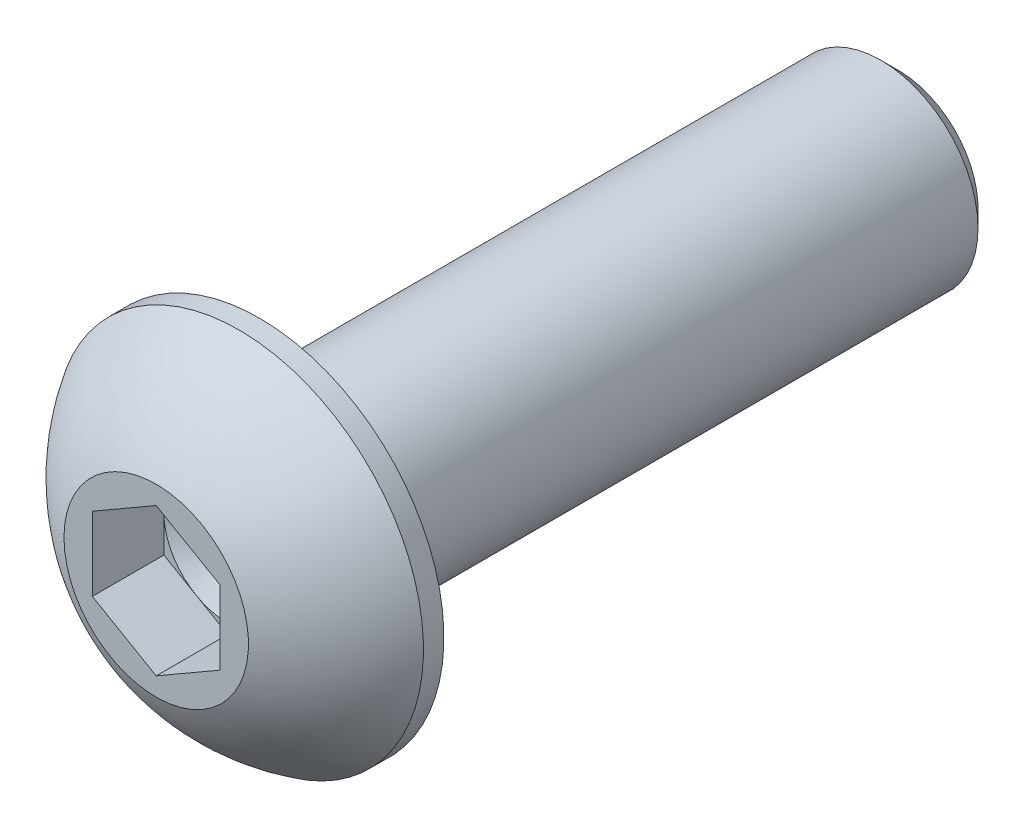
ISO-10303-21;
HEADER;
FILE_DESCRIPTION(('STEP AP214'),'2;1');
FILE_NAME('part.step','',(''),(''),'','','');
FILE_SCHEMA(('AUTOMOTIVE_DESIGN { 1 0 10303 214 1 1 1 1 }'));
ENDSEC;
DATA;
#1=APPLICATION_CONTEXT('core data for automotive mechanical design processes');
#2=APPLICATION_PROTOCOL_DEFINITION('international standard','automotive_design',2000,#1);
#3=PRODUCT_CONTEXT('',#1,'mechanical');
#4=PRODUCT('Part','Part','',(#3));
#5=PRODUCT_RELATED_PRODUCT_CATEGORY('part','',(#4));
#6=PRODUCT_DEFINITION_FORMATION('','',#4);
#7=PRODUCT_DEFINITION_CONTEXT('part definition',#1,'design');
#8=PRODUCT_DEFINITION('design','',#6,#7);
#9=PRODUCT_DEFINITION_SHAPE('','',#8);
#10=(LENGTH_UNIT() NAMED_UNIT(*) SI_UNIT(.MILLI.,.METRE.));
#11=(NAMED_UNIT(*) PLANE_ANGLE_UNIT() SI_UNIT($,.RADIAN.));
#12=(NAMED_UNIT(*) SI_UNIT($,.STERADIAN.) SOLID_ANGLE_UNIT());
#13=UNCERTAINTY_MEASURE_WITH_UNIT(LENGTH_MEASURE(1.E-05),#10,'distance_accuracy_value','');
#14=(GEOMETRIC_REPRESENTATION_CONTEXT(3) GLOBAL_UNCERTAINTY_ASSIGNED_CONTEXT((#13)) GLOBAL_UNIT_ASSIGNED_CONTEXT((#10,
#11,#12)) REPRESENTATION_CONTEXT('',''));
#15=CARTESIAN_POINT('',(0.,0.,0.));
#16=DIRECTION('',(0.,0.,1.));
#17=DIRECTION('',(1.,0.,0.));
#18=AXIS2_PLACEMENT_3D('',#15,#16,#17);
#19=CARTESIAN_POINT('',(0.,0.,-1.778));
#20=DIRECTION('',(0.,0.,1.));
#21=DIRECTION('',(1.,0.,0.));
#22=AXIS2_PLACEMENT_3D('',#19,#20,#21);
#23=PLANE('',#22);
#24=CARTESIAN_POINT('',(0.,0.,-1.778));
#25=DIRECTION('',(0.,0.,1.));
#26=DIRECTION('',(1.,0.,0.));
#27=AXIS2_PLACEMENT_3D('',#24,#25,#26);
#28=CIRCLE('',#27,1.5875);
#29=CARTESIAN_POINT('',(1.5875,0.,-1.778));
#30=VERTEX_POINT('',#29);
#31=CARTESIAN_POINT('',(0.79375,1.3748153285078,-1.778));
#32=VERTEX_POINT('',#31);
#33=EDGE_CURVE('E96',#30,#32,#28,.T.);
#34=ORIENTED_EDGE('',*,*,#33,.F.);
#35=DIRECTION('',(0.,-1.,0.));
#36=VECTOR('',#35,1.);
#37=CARTESIAN_POINT('',(1.5875,0.,-1.778));
#38=LINE('',#37,#36);
#39=CARTESIAN_POINT('',(1.5875,0.916543552338531,-1.778));
#40=VERTEX_POINT('',#39);
#41=EDGE_CURVE('E120',#40,#30,#38,.T.);
#42=ORIENTED_EDGE('',*,*,#41,.F.);
#43=DIRECTION('',(0.866025403784438,-0.5,0.));
#44=VECTOR('',#43,1.);
#45=CARTESIAN_POINT('',(0.79375,1.3748153285078,-1.778));
#46=LINE('',#45,#44);
#47=EDGE_CURVE('E118',#32,#40,#46,.T.);
#48=ORIENTED_EDGE('',*,*,#47,.F.);
#49=EDGE_LOOP('',(#34,#42,#48));
#50=FACE_BOUND('',#49,.T.);
#51=ADVANCED_FACE('F17',(#50),#23,.T.);
#52=CARTESIAN_POINT('',(-0.79375,1.37481532850779,-1.778));
#53=VERTEX_POINT('',#52);
#54=EDGE_CURVE('E98',#32,#53,#28,.T.);
#55=ORIENTED_EDGE('',*,*,#54,.F.);
#56=CARTESIAN_POINT('',(0.,1.83308710467706,-1.778));
#57=VERTEX_POINT('',#56);
#58=EDGE_CURVE('E113',#57,#32,#46,.T.);
#59=ORIENTED_EDGE('',*,*,#58,.F.);
#60=DIRECTION('',(0.866025403784437,0.5,0.));
#61=VECTOR('',#60,1.);
#62=CARTESIAN_POINT('',(-0.79375,1.37481532850779,-1.778));
#63=LINE('',#62,#61);
#64=EDGE_CURVE('E114',#53,#57,#63,.T.);
#65=ORIENTED_EDGE('',*,*,#64,.F.);
#66=EDGE_LOOP('',(#55,#59,#65));
#67=FACE_BOUND('',#66,.T.);
#68=ADVANCED_FACE('F111',(#67),#23,.T.);
#69=CARTESIAN_POINT('',(-1.5875,0.,-1.778));
#70=VERTEX_POINT('',#69);
#71=EDGE_CURVE('E117',#53,#70,#28,.T.);
#72=ORIENTED_EDGE('',*,*,#71,.F.);
#73=CARTESIAN_POINT('',(-1.5875,0.916543552338527,-1.778));
#74=VERTEX_POINT('',#73);
#75=EDGE_CURVE('E135',#74,#53,#63,.T.);
#76=ORIENTED_EDGE('',*,*,#75,.F.);
#77=DIRECTION('',(0.,1.,0.));
#78=VECTOR('',#77,1.);
#79=CARTESIAN_POINT('',(-1.5875,0.,-1.778));
#80=LINE('',#79,#78);
#81=EDGE_CURVE('E139',#70,#74,#80,.T.);
#82=ORIENTED_EDGE('',*,*,#81,.F.);
#83=EDGE_LOOP('',(#72,#76,#82));
#84=FACE_BOUND('',#83,.T.);
#85=ADVANCED_FACE('F227',(#84),#23,.T.);
#86=CARTESIAN_POINT('',(-0.79375,-1.3748153285078,-1.778));
#87=VERTEX_POINT('',#86);
#88=EDGE_CURVE('E252',#70,#87,#28,.T.);
#89=ORIENTED_EDGE('',*,*,#88,.F.);
#90=CARTESIAN_POINT('',(-1.5875,-0.916543552338531,-1.778));
#91=VERTEX_POINT('',#90);
#92=EDGE_CURVE('E140',#91,#70,#80,.T.);
#93=ORIENTED_EDGE('',*,*,#92,.F.);
#94=DIRECTION('',(-0.866025403784438,0.5,0.));
#95=VECTOR('',#94,1.);
#96=CARTESIAN_POINT('',(-0.79375,-1.3748153285078,-1.778));
#97=LINE('',#96,#95);
#98=EDGE_CURVE('E144',#87,#91,#97,.T.);
#99=ORIENTED_EDGE('',*,*,#98,.F.);
#100=EDGE_LOOP('',(#89,#93,#99));
#101=FACE_BOUND('',#100,.T.);
#102=ADVANCED_FACE('F239',(#101),#23,.T.);
#103=CARTESIAN_POINT('',(0.79375,-1.37481532850779,-1.778));
#104=VERTEX_POINT('',#103);
#105=EDGE_CURVE('E33',#87,#104,#28,.T.);
#106=ORIENTED_EDGE('',*,*,#105,.F.);
#107=CARTESIAN_POINT('',(0.,-1.83308710467706,-1.778));
#108=VERTEX_POINT('',#107);
#109=EDGE_CURVE('E145',#108,#87,#97,.T.);
#110=ORIENTED_EDGE('',*,*,#109,.F.);
#111=DIRECTION('',(-0.866025403784437,-0.5,0.));
#112=VECTOR('',#111,1.);
#113=CARTESIAN_POINT('',(0.79375,-1.37481532850779,-1.778));
#114=LINE('',#113,#112);
#115=EDGE_CURVE('E149',#104,#108,#114,.T.);
#116=ORIENTED_EDGE('',*,*,#115,.F.);
#117=EDGE_LOOP('',(#106,#110,#116));
#118=FACE_BOUND('',#117,.T.);
#119=ADVANCED_FACE('F232',(#118),#23,.T.);
#120=CARTESIAN_POINT('',(-1.146175,0.,0.));
#121=DIRECTION('',(0.,0.,1.));
#122=DIRECTION('',(1.,0.,0.));
#123=AXIS2_PLACEMENT_3D('',#120,#121,#122);
#124=PLANE('',#123);
#125=CARTESIAN_POINT('',(0.,0.,0.));
#126=DIRECTION('',(0.,0.,-1.));
#127=DIRECTION('',(-1.,0.,0.));
#128=AXIS2_PLACEMENT_3D('',#125,#126,#127);
#129=CIRCLE('',#128,2.29235);
#130=CARTESIAN_POINT('',(-2.29235000000001,0.,0.));
#131=VERTEX_POINT('',#130);
#132=EDGE_CURVE('E196',#131,#131,#129,.T.);
#133=ORIENTED_EDGE('',*,*,#132,.F.);
#134=EDGE_LOOP('',(#133));
#135=FACE_BOUND('',#134,.T.);
#136=DIRECTION('',(0.866025403784437,0.5,0.));
#137=VECTOR('',#136,1.);
#138=CARTESIAN_POINT('',(-0.79375,1.37481532850779,0.));
#139=LINE('',#138,#137);
#140=CARTESIAN_POINT('',(-1.5875,0.916543552338527,0.));
#141=VERTEX_POINT('',#140);
#142=CARTESIAN_POINT('',(0.,1.83308710467706,0.));
#143=VERTEX_POINT('',#142);
#144=EDGE_CURVE('E160',#141,#143,#139,.T.);
#145=ORIENTED_EDGE('',*,*,#144,.T.);
#146=DIRECTION('',(0.866025403784438,-0.5,0.));
#147=VECTOR('',#146,1.);
#148=CARTESIAN_POINT('',(0.79375,1.3748153285078,0.));
#149=LINE('',#148,#147);
#150=CARTESIAN_POINT('',(1.5875,0.916543552338531,0.));
#151=VERTEX_POINT('',#150);
#152=EDGE_CURVE('E106',#143,#151,#149,.T.);
#153=ORIENTED_EDGE('',*,*,#152,.T.);
#154=DIRECTION('',(0.,-1.,0.));
#155=VECTOR('',#154,1.);
#156=CARTESIAN_POINT('',(1.5875,0.,0.));
#157=LINE('',#156,#155);
#158=CARTESIAN_POINT('',(1.5875,-0.916543552338531,0.));
#159=VERTEX_POINT('',#158);
#160=EDGE_CURVE('E124',#151,#159,#157,.T.);
#161=ORIENTED_EDGE('',*,*,#160,.T.);
#162=DIRECTION('',(-0.866025403784437,-0.5,0.));
#163=VECTOR('',#162,1.);
#164=CARTESIAN_POINT('',(0.79375,-1.37481532850779,0.));
#165=LINE('',#164,#163);
#166=CARTESIAN_POINT('',(0.,-1.83308710467706,0.));
#167=VERTEX_POINT('',#166);
#168=EDGE_CURVE('E41',#159,#167,#165,.T.);
#169=ORIENTED_EDGE('',*,*,#168,.T.);
#170=DIRECTION('',(-0.866025403784438,0.5,0.));
#171=VECTOR('',#170,1.);
#172=CARTESIAN_POINT('',(-0.79375,-1.3748153285078,0.));
#173=LINE('',#172,#171);
#174=CARTESIAN_POINT('',(-1.5875,-0.916543552338531,0.));
#175=VERTEX_POINT('',#174);
#176=EDGE_CURVE('E168',#167,#175,#173,.T.);
#177=ORIENTED_EDGE('',*,*,#176,.T.);
#178=DIRECTION('',(0.,1.,0.));
#179=VECTOR('',#178,1.);
#180=CARTESIAN_POINT('',(-1.5875,0.,0.));
#181=LINE('',#180,#179);
#182=EDGE_CURVE('E164',#175,#141,#181,.T.);
#183=ORIENTED_EDGE('',*,*,#182,.T.);
#184=EDGE_LOOP('',(#145,#153,#161,#169,#177,#183));
#185=FACE_BOUND('',#184,.T.);
#186=ADVANCED_FACE('F238',(#135,#185),#124,.T.);
#187=CARTESIAN_POINT('',(0.,0.,1.48381805047393));
#188=DIRECTION('',(0.,0.,-1.));
#189=DIRECTION('',(-1.,0.,0.));
#190=AXIS2_PLACEMENT_3D('',#187,#188,#189);
#191=CYLINDRICAL_SURFACE('',#190,4.5847);
#192=CARTESIAN_POINT('',(0.,0.,-2.0574));
#193=DIRECTION('',(0.,0.,-1.));
#194=DIRECTION('',(-1.,0.,0.));
#195=AXIS2_PLACEMENT_3D('',#192,#193,#194);
#196=CIRCLE('',#195,4.5847);
#197=CARTESIAN_POINT('',(-4.5847,0.,-2.0574));
#198=VERTEX_POINT('',#197);
#199=EDGE_CURVE('E192',#198,#198,#196,.T.);
#200=ORIENTED_EDGE('',*,*,#199,.T.);
#201=EDGE_LOOP('',(#200));
#202=FACE_BOUND('',#201,.T.);
#203=CARTESIAN_POINT('',(0.,0.,-2.5654));
#204=DIRECTION('',(0.,0.,-1.));
#205=DIRECTION('',(-1.,0.,0.));
#206=AXIS2_PLACEMENT_3D('',#203,#204,#205);
#207=CIRCLE('',#206,4.5847);
#208=CARTESIAN_POINT('',(-4.5847,0.,-2.5654));
#209=VERTEX_POINT('',#208);
#210=EDGE_CURVE('E208',#209,#209,#207,.T.);
#211=ORIENTED_EDGE('',*,*,#210,.F.);
#212=EDGE_LOOP('',(#211));
#213=FACE_BOUND('',#212,.T.);
#214=ADVANCED_FACE('F244',(#202,#213),#191,.T.);
#215=CARTESIAN_POINT('',(-3.68935,0.,-2.5654));
#216=DIRECTION('',(0.,0.,-1.));
#217=DIRECTION('',(-1.,0.,0.));
#218=AXIS2_PLACEMENT_3D('',#215,#216,#217);
#219=PLANE('',#218);
#220=ORIENTED_EDGE('',*,*,#210,.T.);
#221=EDGE_LOOP('',(#220));
#222=FACE_BOUND('',#221,.T.);
#223=CARTESIAN_POINT('',(0.,0.,-2.5654));
#224=DIRECTION('',(0.,0.,-1.));
#225=DIRECTION('',(-1.,0.,0.));
#226=AXIS2_PLACEMENT_3D('',#223,#224,#225);
#227=CIRCLE('',#226,2.794);
#228=CARTESIAN_POINT('',(-2.794,0.,-2.5654));
#229=VERTEX_POINT('',#228);
#230=EDGE_CURVE('E204',#229,#229,#227,.T.);
#231=ORIENTED_EDGE('',*,*,#230,.F.);
#232=EDGE_LOOP('',(#231));
#233=FACE_BOUND('',#232,.T.);
#234=ADVANCED_FACE('F303',(#222,#233),#219,.T.);
#235=CARTESIAN_POINT('',(0.,0.,-2.9464));
#236=DIRECTION('',(0.,0.,-1.));
#237=DIRECTION('',(-1.,0.,0.));
#238=AXIS2_PLACEMENT_3D('',#235,#236,#237);
#239=TOROIDAL_SURFACE('',#238,2.794,0.381);
#240=ORIENTED_EDGE('',*,*,#230,.T.);
#241=EDGE_LOOP('',(#240));
#242=FACE_BOUND('',#241,.T.);
#243=CARTESIAN_POINT('',(0.,0.,-2.9464));
#244=DIRECTION('',(0.,0.,-1.));
#245=DIRECTION('',(-1.,0.,0.));
#246=AXIS2_PLACEMENT_3D('',#243,#244,#245);
#247=CIRCLE('',#246,2.413);
#248=CARTESIAN_POINT('',(-2.413,0.,-2.9464));
#249=VERTEX_POINT('',#248);
#250=EDGE_CURVE('E200',#249,#249,#247,.T.);
#251=ORIENTED_EDGE('',*,*,#250,.F.);
#252=EDGE_LOOP('',(#251));
#253=FACE_BOUND('',#252,.T.);
#254=ADVANCED_FACE('F299',(#242,#253),#239,.F.);
#255=CARTESIAN_POINT('',(0.,0.,1.48381805047393));
#256=DIRECTION('',(0.,0.,-1.));
#257=DIRECTION('',(-1.,0.,0.));
#258=AXIS2_PLACEMENT_3D('',#255,#256,#257);
#259=CYLINDRICAL_SURFACE('',#258,2.413);
#260=CARTESIAN_POINT('',(0.,0.,-18.01145761938));
#261=DIRECTION('',(0.,0.,-1.));
#262=DIRECTION('',(-1.,0.,0.));
#263=AXIS2_PLACEMENT_3D('',#260,#261,#262);
#264=CIRCLE('',#263,2.413);
#265=CARTESIAN_POINT('',(-2.413,0.,-18.01145761938));
#266=VERTEX_POINT('',#265);
#267=EDGE_CURVE('E11',#266,#266,#264,.F.);
#268=ORIENTED_EDGE('',*,*,#267,.T.);
#269=EDGE_LOOP('',(#268));
#270=FACE_BOUND('',#269,.T.);
#271=ORIENTED_EDGE('',*,*,#250,.T.);
#272=EDGE_LOOP('',(#271));
#273=FACE_BOUND('',#272,.T.);
#274=ADVANCED_FACE('F296',(#270,#273),#259,.T.);
#275=CARTESIAN_POINT('',(-1.2065,0.,-18.4404));
#276=DIRECTION('',(0.,0.,-1.));
#277=DIRECTION('',(-1.,0.,0.));
#278=AXIS2_PLACEMENT_3D('',#275,#276,#277);
#279=PLANE('',#278);
#280=CARTESIAN_POINT('',(0.,0.,-18.4404));
#281=DIRECTION('',(0.,0.,-1.));
#282=DIRECTION('',(-1.,0.,0.));
#283=AXIS2_PLACEMENT_3D('',#280,#281,#282);
#284=CIRCLE('',#283,1.98405761938);
#285=CARTESIAN_POINT('',(-1.98405761938,0.,-18.4404));
#286=VERTEX_POINT('',#285);
#287=EDGE_CURVE('E26',#286,#286,#284,.T.);
#288=ORIENTED_EDGE('',*,*,#287,.T.);
#289=EDGE_LOOP('',(#288));
#290=FACE_BOUND('',#289,.T.);
#291=ADVANCED_FACE('F216',(#290),#279,.T.);
#292=CARTESIAN_POINT('',(0.,0.,-4.85989606481481));
#293=DIRECTION('',(0.,0.,-1.));
#294=DIRECTION('',(-1.,0.,0.));
#295=AXIS2_PLACEMENT_3D('',#292,#293,#294);
#296=SPHERICAL_SURFACE('',#295,5.37340285883187);
#297=CARTESIAN_POINT('',(-4.5847,0.,-2.0574));
#298=CARTESIAN_POINT('',(-4.56772775071365,0.,-2.02963444466225));
#299=CARTESIAN_POINT('',(-4.55050321576171,0.,-2.00202310563314));
#300=CARTESIAN_POINT('',(-4.51555538986232,0.,-1.94711789153313));
#301=CARTESIAN_POINT('',(-4.49783209891487,0.,-1.91982401646224));
#302=CARTESIAN_POINT('',(-4.4618925763601,0.,-1.8655627616196));
#303=CARTESIAN_POINT('',(-4.44367634475278,0.,-1.83859538184787));
#304=CARTESIAN_POINT('',(-4.40675696303686,0.,-1.78499601309644));
#305=CARTESIAN_POINT('',(-4.38805381292827,0.,-1.75836402411674));
#306=CARTESIAN_POINT('',(-4.35016676527117,0.,-1.70544422925954));
#307=CARTESIAN_POINT('',(-4.33098286772266,0.,-1.67915642338203));
#308=CARTESIAN_POINT('',(-4.29214065809995,0.,-1.62693367141508));
#309=CARTESIAN_POINT('',(-4.27248234602574,0.,-1.60099872532564));
#310=CARTESIAN_POINT('',(-4.23269779601254,0.,-1.54949025368841));
#311=CARTESIAN_POINT('',(-4.21257155807355,0.,-1.52391672814064));
#312=CARTESIAN_POINT('',(-4.17185779967265,0.,-1.4731395388975));
#313=CARTESIAN_POINT('',(-4.15127027921075,0.,-1.44793587520214));
#314=CARTESIAN_POINT('',(-4.10964075130566,0.,-1.39790672892889));
#315=CARTESIAN_POINT('',(-4.08859874386249,0.,-1.37308124635099));
#316=CARTESIAN_POINT('',(-4.04606718757048,0.,-1.32381665673685));
#317=CARTESIAN_POINT('',(-4.02457763872164,0.,-1.29937754970059));
#318=CARTESIAN_POINT('',(-3.98115809291457,0.,-1.25089377806135));
#319=CARTESIAN_POINT('',(-3.95922809595633,0.,-1.22684911345837));
#320=CARTESIAN_POINT('',(-3.91493489261154,0.,-1.1791621633785));
#321=CARTESIAN_POINT('',(-3.892571686225,0.,-1.15551987790161));
#322=CARTESIAN_POINT('',(-3.84741944569869,0.,-1.10864548994917));
#323=CARTESIAN_POINT('',(-3.82463041155893,0.,-1.08541338747362));
#324=CARTESIAN_POINT('',(-3.77863403775912,0.,-1.03936703400529));
#325=CARTESIAN_POINT('',(-3.75542669809908,0.,-1.01655278301252));
#326=CARTESIAN_POINT('',(-3.70860137356642,0.,-0.971349663066289));
#327=CARTESIAN_POINT('',(-3.68498338869382,0.,-0.94896079411283));
#328=CARTESIAN_POINT('',(-3.63734456959005,0.,-0.904615828391113));
#329=CARTESIAN_POINT('',(-3.61332373535889,0.,-0.882659731622856));
#330=CARTESIAN_POINT('',(-3.56488714636506,0.,-0.839187557567447));
#331=CARTESIAN_POINT('',(-3.54047139160238,0.,-0.817671480280295));
#332=CARTESIAN_POINT('',(-3.4912530207284,0.,-0.775086447240822));
#333=CARTESIAN_POINT('',(-3.4664504046171,0.,-0.754017491488501));
#334=CARTESIAN_POINT('',(-3.41646649792444,0.,-0.712333655985979));
#335=CARTESIAN_POINT('',(-3.39128520734309,0.,-0.691718776235777));
#336=CARTESIAN_POINT('',(-3.34055226358225,0.,-0.650949897322802));
#337=CARTESIAN_POINT('',(-3.31500061040276,0.,-0.630795898160027));
#338=CARTESIAN_POINT('',(-3.26353537556731,0.,-0.590955432879197));
#339=CARTESIAN_POINT('',(-3.23762179391134,0.,-0.57126896676114));
#340=CARTESIAN_POINT('',(-3.18544125571044,0.,-0.532370065703055));
#341=CARTESIAN_POINT('',(-3.15917429916551,0.,-0.513157630763025));
#342=CARTESIAN_POINT('',(-3.10629568141643,0.,-0.475213133725829));
#343=CARTESIAN_POINT('',(-3.07968402021229,0.,-0.456481071628663));
#344=CARTESIAN_POINT('',(-3.02612477715573,0.,-0.419503503378719));
#345=CARTESIAN_POINT('',(-2.99917719530331,0.,-0.40125799722594));
#346=CARTESIAN_POINT('',(-2.94495500583993,0.,-0.365259563367945));
#347=CARTESIAN_POINT('',(-2.91768039822897,0.,-0.347506635662729));
#348=CARTESIAN_POINT('',(-2.8628131600919,0.,-0.312499218594777));
#349=CARTESIAN_POINT('',(-2.83522052956579,0.,-0.295244729232041));
#350=CARTESIAN_POINT('',(-2.77972635338319,0.,-0.261239884283562));
#351=CARTESIAN_POINT('',(-2.75182480772671,0.,-0.244489528697819));
#352=CARTESIAN_POINT('',(-2.69572201115466,0.,-0.211498480091079));
#353=CARTESIAN_POINT('',(-2.6675207602391,0.,-0.195257787070081));
#354=CARTESIAN_POINT('',(-2.61082786150165,0.,-0.163291425052401));
#355=CARTESIAN_POINT('',(-2.58233621367977,0.,-0.147565756055718));
#356=CARTESIAN_POINT('',(-2.52507192700006,0.,-0.116634630180611));
#357=CARTESIAN_POINT('',(-2.49629928814224,0.,-0.101429173302187));
#358=CARTESIAN_POINT('',(-2.43848251180434,0.,-0.0715435006068001));
#359=CARTESIAN_POINT('',(-2.40943837432427,0.,-0.0568632847898376));
#360=CARTESIAN_POINT('',(-2.35108820593536,0.,-0.0280329029080984));
#361=CARTESIAN_POINT('',(-2.32178217502651,0.,-0.0138827368433216));
#362=CARTESIAN_POINT('',(-2.29235000000001,0.,0.));
#363=B_SPLINE_CURVE_WITH_KNOTS('',3,(#297,#298,#299,#300,#301,#302,#303,#304,#305,#306,#307,
#308,#309,#310,#311,#312,#313,#314,#315,#316,#317,#318,#319,#320,#321,#322,#323,#324,#325,#326,
#327,#328,#329,#330,#331,#332,#333,#334,#335,#336,#337,#338,#339,#340,#341,#342,#343,#344,#345,
#346,#347,#348,#349,#350,#351,#352,#353,#354,#355,#356,#357,#358,#359,#360,#361,#362),
.UNSPECIFIED.,.F.,.F.,(4,2,2,2,2,2,2,2,2,2,2,2,2,2,2,2,2,2,2,2,2,2,2,2,2,2,2,2,2,2,2,2,4),(0.,
0.09762472664678,0.195249453293559,0.292874179940339,0.390498906587117,0.488123633233897,
0.585748359880676,0.683373086527455,0.780997813174235,0.878622539821013,0.976247266467793,
1.07387199311457,1.17149671976135,1.26912144640813,1.36674617305491,1.46437089970169,
1.56199562634847,1.65962035299525,1.75724507964203,1.85486980628881,1.95249453293559,
2.05011925958237,2.14774398622914,2.24536871287592,2.3429934395227,2.44061816616948,
2.53824289281626,2.63586761946304,2.73349234610982,2.8311170727566,2.92874179940338,
3.02636652605016,3.12399125269694),.UNSPECIFIED.);
#364=EDGE_CURVE('BSEAM287',#198,#131,#363,.T.);
#365=ORIENTED_EDGE('',*,*,#199,.F.);
#366=ORIENTED_EDGE('',*,*,#132,.T.);
#367=ORIENTED_EDGE('',*,*,#364,.T.);
#368=ORIENTED_EDGE('',*,*,#364,.F.);
#369=EDGE_LOOP('',(#365,#367,#366,#368));
#370=FACE_BOUND('',#369,.T.);
#371=ADVANCED_FACE('F287',(#370),#296,.T.);
#372=CARTESIAN_POINT('',(0.79375,1.3748153285078,-1.778));
#373=DIRECTION('',(-0.5,-0.866025403784438,0.));
#374=DIRECTION('',(0.866025403784438,-0.5,0.));
#375=AXIS2_PLACEMENT_3D('',#372,#373,#374);
#376=PLANE('',#375);
#377=ORIENTED_EDGE('',*,*,#152,.F.);
#378=DIRECTION('',(0.,0.,1.));
#379=VECTOR('',#378,1.);
#380=CARTESIAN_POINT('',(0.,1.83308710467706,-1.778));
#381=LINE('',#380,#379);
#382=EDGE_CURVE('E129',#57,#143,#381,.T.);
#383=ORIENTED_EDGE('',*,*,#382,.F.);
#384=ORIENTED_EDGE('',*,*,#58,.T.);
#385=ORIENTED_EDGE('',*,*,#47,.T.);
#386=DIRECTION('',(0.,0.,1.));
#387=VECTOR('',#386,1.);
#388=CARTESIAN_POINT('',(1.5875,0.916543552338531,-1.778));
#389=LINE('',#388,#387);
#390=EDGE_CURVE('E157',#40,#151,#389,.T.);
#391=ORIENTED_EDGE('',*,*,#390,.T.);
#392=EDGE_LOOP('',(#377,#383,#384,#385,#391));
#393=FACE_BOUND('',#392,.T.);
#394=ADVANCED_FACE('F128',(#393),#376,.T.);
#395=CARTESIAN_POINT('',(-0.79375,1.37481532850779,-1.778));
#396=DIRECTION('',(0.5,-0.866025403784437,0.));
#397=DIRECTION('',(0.866025403784437,0.5,0.));
#398=AXIS2_PLACEMENT_3D('',#395,#396,#397);
#399=PLANE('',#398);
#400=ORIENTED_EDGE('',*,*,#144,.F.);
#401=DIRECTION('',(0.,0.,1.));
#402=VECTOR('',#401,1.);
#403=CARTESIAN_POINT('',(-1.5875,0.916543552338527,-1.778));
#404=LINE('',#403,#402);
#405=EDGE_CURVE('E187',#74,#141,#404,.T.);
#406=ORIENTED_EDGE('',*,*,#405,.F.);
#407=ORIENTED_EDGE('',*,*,#75,.T.);
#408=ORIENTED_EDGE('',*,*,#64,.T.);
#409=ORIENTED_EDGE('',*,*,#382,.T.);
#410=EDGE_LOOP('',(#400,#406,#407,#408,#409));
#411=FACE_BOUND('',#410,.T.);
#412=ADVANCED_FACE('F280',(#411),#399,.T.);
#413=CARTESIAN_POINT('',(-1.5875,0.,-1.778));
#414=DIRECTION('',(1.,0.,0.));
#415=DIRECTION('',(0.,0.,-1.));
#416=AXIS2_PLACEMENT_3D('',#413,#414,#415);
#417=PLANE('',#416);
#418=ORIENTED_EDGE('',*,*,#182,.F.);
#419=DIRECTION('',(0.,0.,1.));
#420=VECTOR('',#419,1.);
#421=CARTESIAN_POINT('',(-1.5875,-0.916543552338531,-1.778));
#422=LINE('',#421,#420);
#423=EDGE_CURVE('E184',#91,#175,#422,.T.);
#424=ORIENTED_EDGE('',*,*,#423,.F.);
#425=ORIENTED_EDGE('',*,*,#92,.T.);
#426=ORIENTED_EDGE('',*,*,#81,.T.);
#427=ORIENTED_EDGE('',*,*,#405,.T.);
#428=EDGE_LOOP('',(#418,#424,#425,#426,#427));
#429=FACE_BOUND('',#428,.T.);
#430=ADVANCED_FACE('F274',(#429),#417,.T.);
#431=CARTESIAN_POINT('',(-0.79375,-1.3748153285078,-1.778));
#432=DIRECTION('',(0.5,0.866025403784438,0.));
#433=DIRECTION('',(-0.866025403784438,0.5,0.));
#434=AXIS2_PLACEMENT_3D('',#431,#432,#433);
#435=PLANE('',#434);
#436=ORIENTED_EDGE('',*,*,#176,.F.);
#437=DIRECTION('',(0.,0.,1.));
#438=VECTOR('',#437,1.);
#439=CARTESIAN_POINT('',(0.,-1.83308710467706,-1.778));
#440=LINE('',#439,#438);
#441=EDGE_CURVE('E182',#108,#167,#440,.T.);
#442=ORIENTED_EDGE('',*,*,#441,.F.);
#443=ORIENTED_EDGE('',*,*,#109,.T.);
#444=ORIENTED_EDGE('',*,*,#98,.T.);
#445=ORIENTED_EDGE('',*,*,#423,.T.);
#446=EDGE_LOOP('',(#436,#442,#443,#444,#445));
#447=FACE_BOUND('',#446,.T.);
#448=ADVANCED_FACE('F261',(#447),#435,.T.);
#449=CARTESIAN_POINT('',(0.79375,-1.37481532850779,-1.778));
#450=DIRECTION('',(-0.5,0.866025403784437,0.));
#451=DIRECTION('',(-0.866025403784437,-0.5,0.));
#452=AXIS2_PLACEMENT_3D('',#449,#450,#451);
#453=PLANE('',#452);
#454=ORIENTED_EDGE('',*,*,#168,.F.);
#455=DIRECTION('',(0.,0.,1.));
#456=VECTOR('',#455,1.);
#457=CARTESIAN_POINT('',(1.5875,-0.916543552338531,-1.778));
#458=LINE('',#457,#456);
#459=CARTESIAN_POINT('',(1.5875,-0.916543552338531,-1.778));
#460=VERTEX_POINT('',#459);
#461=EDGE_CURVE('E179',#460,#159,#458,.T.);
#462=ORIENTED_EDGE('',*,*,#461,.F.);
#463=EDGE_CURVE('E150',#460,#104,#114,.T.);
#464=ORIENTED_EDGE('',*,*,#463,.T.);
#465=ORIENTED_EDGE('',*,*,#115,.T.);
#466=ORIENTED_EDGE('',*,*,#441,.T.);
#467=EDGE_LOOP('',(#454,#462,#464,#465,#466));
#468=FACE_BOUND('',#467,.T.);
#469=ADVANCED_FACE('F235',(#468),#453,.T.);
#470=CARTESIAN_POINT('',(1.5875,0.,-1.778));
#471=DIRECTION('',(-1.,0.,0.));
#472=DIRECTION('',(0.,0.,1.));
#473=AXIS2_PLACEMENT_3D('',#470,#471,#472);
#474=PLANE('',#473);
#475=ORIENTED_EDGE('',*,*,#160,.F.);
#476=ORIENTED_EDGE('',*,*,#390,.F.);
#477=ORIENTED_EDGE('',*,*,#41,.T.);
#478=EDGE_CURVE('E154',#30,#460,#38,.T.);
#479=ORIENTED_EDGE('',*,*,#478,.T.);
#480=ORIENTED_EDGE('',*,*,#461,.T.);
#481=EDGE_LOOP('',(#475,#476,#477,#479,#480));
#482=FACE_BOUND('',#481,.T.);
#483=ADVANCED_FACE('F230',(#482),#474,.T.);
#484=EDGE_CURVE('E100',#104,#30,#28,.T.);
#485=ORIENTED_EDGE('',*,*,#484,.F.);
#486=ORIENTED_EDGE('',*,*,#463,.F.);
#487=ORIENTED_EDGE('',*,*,#478,.F.);
#488=EDGE_LOOP('',(#485,#486,#487));
#489=FACE_BOUND('',#488,.T.);
#490=ADVANCED_FACE('F93',(#489),#23,.T.);
#491=CARTESIAN_POINT('',(0.,0.,-1.778));
#492=DIRECTION('',(0.,0.,1.));
#493=DIRECTION('',(1.,0.,0.));
#494=AXIS2_PLACEMENT_3D('',#491,#492,#493);
#495=CONICAL_SURFACE('',#494,1.5875,1.0471975511966);
#496=CARTESIAN_POINT('',(0.,0.,-2.69454355233854));
#497=VERTEX_POINT('',#496);
#498=VERTEX_LOOP('',#497);
#499=FACE_BOUND('',#498,.T.);
#500=ORIENTED_EDGE('',*,*,#33,.T.);
#501=ORIENTED_EDGE('',*,*,#54,.T.);
#502=ORIENTED_EDGE('',*,*,#71,.T.);
#503=ORIENTED_EDGE('',*,*,#88,.T.);
#504=ORIENTED_EDGE('',*,*,#105,.T.);
#505=ORIENTED_EDGE('',*,*,#484,.T.);
#506=EDGE_LOOP('',(#500,#501,#502,#503,#504,#505));
#507=FACE_BOUND('',#506,.T.);
#508=ADVANCED_FACE('F91',(#499,#507),#495,.F.);
#509=CARTESIAN_POINT('',(0.,0.,-18.4404));
#510=DIRECTION('',(0.,0.,1.));
#511=DIRECTION('',(1.,0.,0.));
#512=AXIS2_PLACEMENT_3D('',#509,#510,#511);
#513=CONICAL_SURFACE('',#512,1.98405761938,0.785398163397449);
#514=ORIENTED_EDGE('',*,*,#267,.F.);
#515=EDGE_LOOP('',(#514));
#516=FACE_BOUND('',#515,.T.);
#517=ORIENTED_EDGE('',*,*,#287,.F.);
#518=EDGE_LOOP('',(#517));
#519=FACE_BOUND('',#518,.T.);
#520=ADVANCED_FACE('F19',(#516,#519),#513,.T.);
#521=CLOSED_SHELL('',(#51,#68,#85,#102,#119,#186,#214,#234,#254,#274,#291,#371,#394,#412,#430,
#448,#469,#483,#490,#508,#520));
#522=MANIFOLD_SOLID_BREP('B1',#521);
#523=ADVANCED_BREP_SHAPE_REPRESENTATION('',(#18,#522),#14);
#524=SHAPE_DEFINITION_REPRESENTATION(#9,#523);
ENDSEC;
END-ISO-10303-21;
